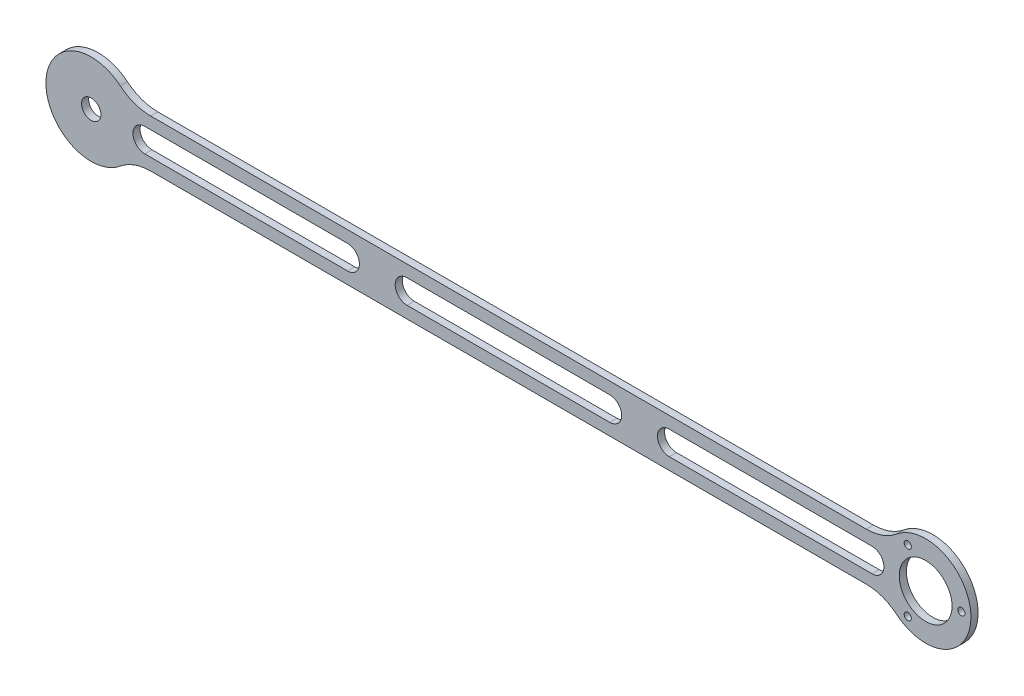
ISO-10303-21;
HEADER;
FILE_DESCRIPTION(('STEP AP214'),'2;1');
FILE_NAME('part.step','',(''),(''),'','','');
FILE_SCHEMA(('AUTOMOTIVE_DESIGN { 1 0 10303 214 1 1 1 1 }'));
ENDSEC;
DATA;
#1=APPLICATION_CONTEXT('core data for automotive mechanical design processes');
#2=APPLICATION_PROTOCOL_DEFINITION('international standard','automotive_design',2000,#1);
#3=PRODUCT_CONTEXT('',#1,'mechanical');
#4=PRODUCT('Part','Part','',(#3));
#5=PRODUCT_RELATED_PRODUCT_CATEGORY('part','',(#4));
#6=PRODUCT_DEFINITION_FORMATION('','',#4);
#7=PRODUCT_DEFINITION_CONTEXT('part definition',#1,'design');
#8=PRODUCT_DEFINITION('design','',#6,#7);
#9=PRODUCT_DEFINITION_SHAPE('','',#8);
#10=(LENGTH_UNIT() NAMED_UNIT(*) SI_UNIT(.MILLI.,.METRE.));
#11=(NAMED_UNIT(*) PLANE_ANGLE_UNIT() SI_UNIT($,.RADIAN.));
#12=(NAMED_UNIT(*) SI_UNIT($,.STERADIAN.) SOLID_ANGLE_UNIT());
#13=UNCERTAINTY_MEASURE_WITH_UNIT(LENGTH_MEASURE(1.E-05),#10,'distance_accuracy_value','');
#14=(GEOMETRIC_REPRESENTATION_CONTEXT(3) GLOBAL_UNCERTAINTY_ASSIGNED_CONTEXT((#13)) GLOBAL_UNIT_ASSIGNED_CONTEXT((#10,
#11,#12)) REPRESENTATION_CONTEXT('',''));
#15=CARTESIAN_POINT('',(0.,0.,0.));
#16=DIRECTION('',(0.,0.,1.));
#17=DIRECTION('',(1.,0.,0.));
#18=AXIS2_PLACEMENT_3D('',#15,#16,#17);
#19=CARTESIAN_POINT('',(350.,0.,1.5));
#20=DIRECTION('',(0.,0.,-1.));
#21=DIRECTION('',(-1.,0.,0.));
#22=AXIS2_PLACEMENT_3D('',#19,#20,#21);
#23=PLANE('',#22);
#24=DIRECTION('',(1.,0.,0.));
#25=VECTOR('',#24,1.);
#26=CARTESIAN_POINT('',(22.5,-5.,1.5));
#27=LINE('',#26,#25);
#28=CARTESIAN_POINT('',(22.5,-5.,1.5));
#29=VERTEX_POINT('',#28);
#30=CARTESIAN_POINT('',(107.5,-5.,1.5));
#31=VERTEX_POINT('',#30);
#32=EDGE_CURVE('E279',#29,#31,#27,.T.);
#33=ORIENTED_EDGE('',*,*,#32,.F.);
#34=CARTESIAN_POINT('',(22.5,0.,1.5));
#35=DIRECTION('',(0.,0.,1.));
#36=DIRECTION('',(1.,0.,0.));
#37=AXIS2_PLACEMENT_3D('',#34,#35,#36);
#38=CIRCLE('',#37,5.);
#39=CARTESIAN_POINT('',(22.5,5.,1.5));
#40=VERTEX_POINT('',#39);
#41=EDGE_CURVE('E141',#40,#29,#38,.T.);
#42=ORIENTED_EDGE('',*,*,#41,.F.);
#43=DIRECTION('',(-1.,0.,0.));
#44=VECTOR('',#43,1.);
#45=CARTESIAN_POINT('',(22.5,5.,1.5));
#46=LINE('',#45,#44);
#47=CARTESIAN_POINT('',(107.5,5.,1.5));
#48=VERTEX_POINT('',#47);
#49=EDGE_CURVE('E286',#48,#40,#46,.T.);
#50=ORIENTED_EDGE('',*,*,#49,.F.);
#51=CARTESIAN_POINT('',(107.5,0.,1.5));
#52=DIRECTION('',(0.,0.,1.));
#53=DIRECTION('',(1.,0.,0.));
#54=AXIS2_PLACEMENT_3D('',#51,#52,#53);
#55=CIRCLE('',#54,5.);
#56=EDGE_CURVE('E267',#31,#48,#55,.T.);
#57=ORIENTED_EDGE('',*,*,#56,.F.);
#58=EDGE_LOOP('',(#33,#42,#50,#57));
#59=FACE_BOUND('',#58,.T.);
#60=DIRECTION('',(1.,0.,0.));
#61=VECTOR('',#60,1.);
#62=CARTESIAN_POINT('',(132.5,-5.,1.5));
#63=LINE('',#62,#61);
#64=CARTESIAN_POINT('',(132.5,-5.,1.5));
#65=VERTEX_POINT('',#64);
#66=CARTESIAN_POINT('',(217.5,-5.,1.5));
#67=VERTEX_POINT('',#66);
#68=EDGE_CURVE('E351',#65,#67,#63,.T.);
#69=ORIENTED_EDGE('',*,*,#68,.F.);
#70=CARTESIAN_POINT('',(132.5,0.,1.5));
#71=DIRECTION('',(0.,0.,1.));
#72=DIRECTION('',(1.,0.,0.));
#73=AXIS2_PLACEMENT_3D('',#70,#71,#72);
#74=CIRCLE('',#73,5.);
#75=CARTESIAN_POINT('',(132.5,5.,1.5));
#76=VERTEX_POINT('',#75);
#77=EDGE_CURVE('E149',#76,#65,#74,.T.);
#78=ORIENTED_EDGE('',*,*,#77,.F.);
#79=DIRECTION('',(-1.,0.,0.));
#80=VECTOR('',#79,1.);
#81=CARTESIAN_POINT('',(132.5,5.,1.5));
#82=LINE('',#81,#80);
#83=CARTESIAN_POINT('',(217.5,5.00000000000002,1.5));
#84=VERTEX_POINT('',#83);
#85=EDGE_CURVE('E343',#84,#76,#82,.T.);
#86=ORIENTED_EDGE('',*,*,#85,.F.);
#87=CARTESIAN_POINT('',(217.5,0.,1.5));
#88=DIRECTION('',(0.,0.,1.));
#89=DIRECTION('',(1.,0.,0.));
#90=AXIS2_PLACEMENT_3D('',#87,#88,#89);
#91=CIRCLE('',#90,5.);
#92=EDGE_CURVE('E347',#67,#84,#91,.T.);
#93=ORIENTED_EDGE('',*,*,#92,.F.);
#94=EDGE_LOOP('',(#69,#78,#86,#93));
#95=FACE_BOUND('',#94,.T.);
#96=DIRECTION('',(1.,0.,0.));
#97=VECTOR('',#96,1.);
#98=CARTESIAN_POINT('',(242.5,-5.,1.5));
#99=LINE('',#98,#97);
#100=CARTESIAN_POINT('',(242.5,-5.,1.5));
#101=VERTEX_POINT('',#100);
#102=CARTESIAN_POINT('',(327.5,-5.,1.5));
#103=VERTEX_POINT('',#102);
#104=EDGE_CURVE('E394',#101,#103,#99,.T.);
#105=ORIENTED_EDGE('',*,*,#104,.F.);
#106=CARTESIAN_POINT('',(242.5,0.,1.5));
#107=DIRECTION('',(0.,0.,1.));
#108=DIRECTION('',(1.,0.,0.));
#109=AXIS2_PLACEMENT_3D('',#106,#107,#108);
#110=CIRCLE('',#109,5.);
#111=CARTESIAN_POINT('',(242.5,5.,1.5));
#112=VERTEX_POINT('',#111);
#113=EDGE_CURVE('E327',#112,#101,#110,.T.);
#114=ORIENTED_EDGE('',*,*,#113,.F.);
#115=DIRECTION('',(-1.,0.,0.));
#116=VECTOR('',#115,1.);
#117=CARTESIAN_POINT('',(242.5,5.,1.5));
#118=LINE('',#117,#116);
#119=CARTESIAN_POINT('',(327.5,5.,1.5));
#120=VERTEX_POINT('',#119);
#121=EDGE_CURVE('E386',#120,#112,#118,.T.);
#122=ORIENTED_EDGE('',*,*,#121,.F.);
#123=CARTESIAN_POINT('',(327.5,0.,1.5));
#124=DIRECTION('',(0.,0.,1.));
#125=DIRECTION('',(1.,0.,0.));
#126=AXIS2_PLACEMENT_3D('',#123,#124,#125);
#127=CIRCLE('',#126,5.);
#128=EDGE_CURVE('E390',#103,#120,#127,.T.);
#129=ORIENTED_EDGE('',*,*,#128,.F.);
#130=EDGE_LOOP('',(#105,#114,#122,#129));
#131=FACE_BOUND('',#130,.T.);
#132=CARTESIAN_POINT('',(365.,0.,1.5));
#133=DIRECTION('',(0.,0.,1.));
#134=DIRECTION('',(1.,0.,0.));
#135=AXIS2_PLACEMENT_3D('',#132,#133,#134);
#136=CIRCLE('',#135,1.50000000000002);
#137=CARTESIAN_POINT('',(366.5,0.,1.5));
#138=VERTEX_POINT('',#137);
#139=EDGE_CURVE('E400',#138,#138,#136,.T.);
#140=ORIENTED_EDGE('',*,*,#139,.F.);
#141=EDGE_LOOP('',(#140));
#142=FACE_BOUND('',#141,.T.);
#143=CARTESIAN_POINT('',(342.5,-12.9903810567666,1.5));
#144=DIRECTION('',(0.,0.,1.));
#145=DIRECTION('',(1.,0.,0.));
#146=AXIS2_PLACEMENT_3D('',#143,#144,#145);
#147=CIRCLE('',#146,1.50000000000008);
#148=CARTESIAN_POINT('',(344.,-12.9903810567666,1.5));
#149=VERTEX_POINT('',#148);
#150=EDGE_CURVE('E405',#149,#149,#147,.T.);
#151=ORIENTED_EDGE('',*,*,#150,.F.);
#152=EDGE_LOOP('',(#151));
#153=FACE_BOUND('',#152,.T.);
#154=CARTESIAN_POINT('',(342.5,12.9903810567665,1.5));
#155=DIRECTION('',(0.,0.,1.));
#156=DIRECTION('',(1.,0.,0.));
#157=AXIS2_PLACEMENT_3D('',#154,#155,#156);
#158=CIRCLE('',#157,1.50000000000002);
#159=CARTESIAN_POINT('',(344.,12.9903810567665,1.5));
#160=VERTEX_POINT('',#159);
#161=EDGE_CURVE('E414',#160,#160,#158,.T.);
#162=ORIENTED_EDGE('',*,*,#161,.F.);
#163=EDGE_LOOP('',(#162));
#164=FACE_BOUND('',#163,.T.);
#165=CARTESIAN_POINT('',(350.,0.,1.5));
#166=DIRECTION('',(0.,0.,-1.));
#167=DIRECTION('',(-1.,0.,0.));
#168=AXIS2_PLACEMENT_3D('',#165,#166,#167);
#169=CIRCLE('',#168,19.);
#170=CARTESIAN_POINT('',(337.859549738812,14.6153846153846,1.5));
#171=VERTEX_POINT('',#170);
#172=CARTESIAN_POINT('',(337.859549738812,-14.6153846153846,1.5));
#173=VERTEX_POINT('',#172);
#174=EDGE_CURVE('E440',#171,#173,#169,.T.);
#175=ORIENTED_EDGE('',*,*,#174,.F.);
#176=CARTESIAN_POINT('',(325.080128411246,30.,1.5));
#177=DIRECTION('',(0.,0.,-1.));
#178=DIRECTION('',(-1.,0.,0.));
#179=AXIS2_PLACEMENT_3D('',#176,#177,#178);
#180=CIRCLE('',#179,20.);
#181=CARTESIAN_POINT('',(325.080128411246,10.,1.5));
#182=VERTEX_POINT('',#181);
#183=EDGE_CURVE('E466',#171,#182,#180,.T.);
#184=ORIENTED_EDGE('',*,*,#183,.T.);
#185=DIRECTION('',(1.,0.,0.));
#186=VECTOR('',#185,1.);
#187=CARTESIAN_POINT('',(24.9198715887542,10.,1.5));
#188=LINE('',#187,#186);
#189=CARTESIAN_POINT('',(24.9198715887542,10.,1.5));
#190=VERTEX_POINT('',#189);
#191=EDGE_CURVE('E462',#190,#182,#188,.T.);
#192=ORIENTED_EDGE('',*,*,#191,.F.);
#193=CARTESIAN_POINT('',(24.9198715887542,30.,1.5));
#194=DIRECTION('',(0.,0.,1.));
#195=DIRECTION('',(1.,0.,0.));
#196=AXIS2_PLACEMENT_3D('',#193,#194,#195);
#197=CIRCLE('',#196,20.);
#198=CARTESIAN_POINT('',(12.140450261188,14.6153846153846,1.5));
#199=VERTEX_POINT('',#198);
#200=EDGE_CURVE('E458',#199,#190,#197,.T.);
#201=ORIENTED_EDGE('',*,*,#200,.F.);
#202=CARTESIAN_POINT('',(0.,0.,1.5));
#203=DIRECTION('',(0.,0.,-1.));
#204=DIRECTION('',(-1.,0.,0.));
#205=AXIS2_PLACEMENT_3D('',#202,#203,#204);
#206=CIRCLE('',#205,19.);
#207=CARTESIAN_POINT('',(12.140450261188,-14.6153846153846,1.5));
#208=VERTEX_POINT('',#207);
#209=EDGE_CURVE('E455',#208,#199,#206,.T.);
#210=ORIENTED_EDGE('',*,*,#209,.F.);
#211=CARTESIAN_POINT('',(24.9198715887542,-30.,1.5));
#212=DIRECTION('',(0.,0.,-1.));
#213=DIRECTION('',(-1.,0.,0.));
#214=AXIS2_PLACEMENT_3D('',#211,#212,#213);
#215=CIRCLE('',#214,20.);
#216=CARTESIAN_POINT('',(24.9198715887542,-10.,1.5));
#217=VERTEX_POINT('',#216);
#218=EDGE_CURVE('E452',#208,#217,#215,.T.);
#219=ORIENTED_EDGE('',*,*,#218,.T.);
#220=DIRECTION('',(1.,0.,0.));
#221=VECTOR('',#220,1.);
#222=CARTESIAN_POINT('',(24.9198715887542,-10.,1.5));
#223=LINE('',#222,#221);
#224=CARTESIAN_POINT('',(325.080128411246,-10.,1.5));
#225=VERTEX_POINT('',#224);
#226=EDGE_CURVE('E449',#217,#225,#223,.T.);
#227=ORIENTED_EDGE('',*,*,#226,.T.);
#228=CARTESIAN_POINT('',(325.080128411246,-30.,1.5));
#229=DIRECTION('',(0.,0.,1.));
#230=DIRECTION('',(1.,0.,0.));
#231=AXIS2_PLACEMENT_3D('',#228,#229,#230);
#232=CIRCLE('',#231,20.);
#233=EDGE_CURVE('E444',#173,#225,#232,.T.);
#234=ORIENTED_EDGE('',*,*,#233,.F.);
#235=EDGE_LOOP('',(#175,#184,#192,#201,#210,#219,#227,#234));
#236=FACE_BOUND('',#235,.T.);
#237=CARTESIAN_POINT('',(0.,0.,1.5));
#238=DIRECTION('',(0.,0.,1.));
#239=DIRECTION('',(1.,0.,0.));
#240=AXIS2_PLACEMENT_3D('',#237,#238,#239);
#241=CIRCLE('',#240,4.075);
#242=CARTESIAN_POINT('',(4.075,0.,1.5));
#243=VERTEX_POINT('',#242);
#244=EDGE_CURVE('E432',#243,#243,#241,.T.);
#245=ORIENTED_EDGE('',*,*,#244,.F.);
#246=EDGE_LOOP('',(#245));
#247=FACE_BOUND('',#246,.T.);
#248=CARTESIAN_POINT('',(350.,0.,1.5));
#249=DIRECTION('',(0.,0.,1.));
#250=DIRECTION('',(1.,0.,0.));
#251=AXIS2_PLACEMENT_3D('',#248,#249,#250);
#252=CIRCLE('',#251,11.075);
#253=CARTESIAN_POINT('',(361.075,0.,1.5));
#254=VERTEX_POINT('',#253);
#255=EDGE_CURVE('E424',#254,#254,#252,.T.);
#256=ORIENTED_EDGE('',*,*,#255,.F.);
#257=EDGE_LOOP('',(#256));
#258=FACE_BOUND('',#257,.T.);
#259=ADVANCED_FACE('F123',(#59,#95,#131,#142,#153,#164,#236,#247,#258),#23,.F.);
#260=CARTESIAN_POINT('',(350.,0.,-1.5));
#261=DIRECTION('',(0.,0.,-1.));
#262=DIRECTION('',(-1.,0.,0.));
#263=AXIS2_PLACEMENT_3D('',#260,#261,#262);
#264=PLANE('',#263);
#265=CARTESIAN_POINT('',(22.5,0.,-1.5));
#266=DIRECTION('',(0.,0.,1.));
#267=DIRECTION('',(1.,0.,0.));
#268=AXIS2_PLACEMENT_3D('',#265,#266,#267);
#269=CIRCLE('',#268,5.);
#270=CARTESIAN_POINT('',(22.5,5.,-1.5));
#271=VERTEX_POINT('',#270);
#272=CARTESIAN_POINT('',(22.5,-5.,-1.5));
#273=VERTEX_POINT('',#272);
#274=EDGE_CURVE('E290',#271,#273,#269,.T.);
#275=ORIENTED_EDGE('',*,*,#274,.T.);
#276=DIRECTION('',(1.,0.,0.));
#277=VECTOR('',#276,1.);
#278=CARTESIAN_POINT('',(22.5,-5.,-1.5));
#279=LINE('',#278,#277);
#280=CARTESIAN_POINT('',(107.5,-5.,-1.5));
#281=VERTEX_POINT('',#280);
#282=EDGE_CURVE('E297',#273,#281,#279,.T.);
#283=ORIENTED_EDGE('',*,*,#282,.T.);
#284=CARTESIAN_POINT('',(107.5,0.,-1.5));
#285=DIRECTION('',(0.,0.,1.));
#286=DIRECTION('',(1.,0.,0.));
#287=AXIS2_PLACEMENT_3D('',#284,#285,#286);
#288=CIRCLE('',#287,5.);
#289=CARTESIAN_POINT('',(107.5,5.,-1.5));
#290=VERTEX_POINT('',#289);
#291=EDGE_CURVE('E270',#281,#290,#288,.T.);
#292=ORIENTED_EDGE('',*,*,#291,.T.);
#293=DIRECTION('',(-1.,0.,0.));
#294=VECTOR('',#293,1.);
#295=CARTESIAN_POINT('',(22.5,5.,-1.5));
#296=LINE('',#295,#294);
#297=EDGE_CURVE('E302',#290,#271,#296,.T.);
#298=ORIENTED_EDGE('',*,*,#297,.T.);
#299=EDGE_LOOP('',(#275,#283,#292,#298));
#300=FACE_BOUND('',#299,.T.);
#301=CARTESIAN_POINT('',(132.5,0.,-1.5));
#302=DIRECTION('',(0.,0.,1.));
#303=DIRECTION('',(1.,0.,0.));
#304=AXIS2_PLACEMENT_3D('',#301,#302,#303);
#305=CIRCLE('',#304,5.);
#306=CARTESIAN_POINT('',(132.5,5.,-1.5));
#307=VERTEX_POINT('',#306);
#308=CARTESIAN_POINT('',(132.5,-5.,-1.5));
#309=VERTEX_POINT('',#308);
#310=EDGE_CURVE('E339',#307,#309,#305,.T.);
#311=ORIENTED_EDGE('',*,*,#310,.T.);
#312=DIRECTION('',(1.,0.,0.));
#313=VECTOR('',#312,1.);
#314=CARTESIAN_POINT('',(132.5,-5.,-1.5));
#315=LINE('',#314,#313);
#316=CARTESIAN_POINT('',(217.5,-4.99999999999998,-1.5));
#317=VERTEX_POINT('',#316);
#318=EDGE_CURVE('E335',#309,#317,#315,.T.);
#319=ORIENTED_EDGE('',*,*,#318,.T.);
#320=CARTESIAN_POINT('',(217.5,0.,-1.5));
#321=DIRECTION('',(0.,0.,1.));
#322=DIRECTION('',(1.,0.,0.));
#323=AXIS2_PLACEMENT_3D('',#320,#321,#322);
#324=CIRCLE('',#323,5.);
#325=CARTESIAN_POINT('',(217.5,5.00000000000002,-1.5));
#326=VERTEX_POINT('',#325);
#327=EDGE_CURVE('E331',#317,#326,#324,.T.);
#328=ORIENTED_EDGE('',*,*,#327,.T.);
#329=DIRECTION('',(-1.,0.,0.));
#330=VECTOR('',#329,1.);
#331=CARTESIAN_POINT('',(132.5,5.,-1.5));
#332=LINE('',#331,#330);
#333=EDGE_CURVE('E317',#326,#307,#332,.T.);
#334=ORIENTED_EDGE('',*,*,#333,.T.);
#335=EDGE_LOOP('',(#311,#319,#328,#334));
#336=FACE_BOUND('',#335,.T.);
#337=CARTESIAN_POINT('',(242.5,0.,-1.5));
#338=DIRECTION('',(0.,0.,1.));
#339=DIRECTION('',(1.,0.,0.));
#340=AXIS2_PLACEMENT_3D('',#337,#338,#339);
#341=CIRCLE('',#340,5.);
#342=CARTESIAN_POINT('',(242.5,5.,-1.5));
#343=VERTEX_POINT('',#342);
#344=CARTESIAN_POINT('',(242.5,-5.,-1.5));
#345=VERTEX_POINT('',#344);
#346=EDGE_CURVE('E382',#343,#345,#341,.T.);
#347=ORIENTED_EDGE('',*,*,#346,.T.);
#348=DIRECTION('',(1.,0.,0.));
#349=VECTOR('',#348,1.);
#350=CARTESIAN_POINT('',(242.5,-5.,-1.5));
#351=LINE('',#350,#349);
#352=CARTESIAN_POINT('',(327.5,-5.,-1.5));
#353=VERTEX_POINT('',#352);
#354=EDGE_CURVE('E378',#345,#353,#351,.T.);
#355=ORIENTED_EDGE('',*,*,#354,.T.);
#356=CARTESIAN_POINT('',(327.5,0.,-1.5));
#357=DIRECTION('',(0.,0.,1.));
#358=DIRECTION('',(1.,0.,0.));
#359=AXIS2_PLACEMENT_3D('',#356,#357,#358);
#360=CIRCLE('',#359,5.);
#361=CARTESIAN_POINT('',(327.5,5.,-1.5));
#362=VERTEX_POINT('',#361);
#363=EDGE_CURVE('E374',#353,#362,#360,.T.);
#364=ORIENTED_EDGE('',*,*,#363,.T.);
#365=DIRECTION('',(-1.,0.,0.));
#366=VECTOR('',#365,1.);
#367=CARTESIAN_POINT('',(242.5,5.,-1.5));
#368=LINE('',#367,#366);
#369=EDGE_CURVE('E361',#362,#343,#368,.T.);
#370=ORIENTED_EDGE('',*,*,#369,.T.);
#371=EDGE_LOOP('',(#347,#355,#364,#370));
#372=FACE_BOUND('',#371,.T.);
#373=CARTESIAN_POINT('',(365.,0.,-1.5));
#374=DIRECTION('',(0.,0.,1.));
#375=DIRECTION('',(1.,0.,0.));
#376=AXIS2_PLACEMENT_3D('',#373,#374,#375);
#377=CIRCLE('',#376,1.50000000000002);
#378=CARTESIAN_POINT('',(366.5,0.,-1.5));
#379=VERTEX_POINT('',#378);
#380=EDGE_CURVE('E404',#379,#379,#377,.T.);
#381=ORIENTED_EDGE('',*,*,#380,.T.);
#382=EDGE_LOOP('',(#381));
#383=FACE_BOUND('',#382,.T.);
#384=CARTESIAN_POINT('',(342.5,-12.9903810567666,-1.5));
#385=DIRECTION('',(0.,0.,1.));
#386=DIRECTION('',(1.,0.,0.));
#387=AXIS2_PLACEMENT_3D('',#384,#385,#386);
#388=CIRCLE('',#387,1.50000000000008);
#389=CARTESIAN_POINT('',(344.,-12.9903810567666,-1.5));
#390=VERTEX_POINT('',#389);
#391=EDGE_CURVE('E410',#390,#390,#388,.T.);
#392=ORIENTED_EDGE('',*,*,#391,.T.);
#393=EDGE_LOOP('',(#392));
#394=FACE_BOUND('',#393,.T.);
#395=CARTESIAN_POINT('',(342.5,12.9903810567665,-1.5));
#396=DIRECTION('',(0.,0.,1.));
#397=DIRECTION('',(1.,0.,0.));
#398=AXIS2_PLACEMENT_3D('',#395,#396,#397);
#399=CIRCLE('',#398,1.50000000000002);
#400=CARTESIAN_POINT('',(344.,12.9903810567665,-1.5));
#401=VERTEX_POINT('',#400);
#402=EDGE_CURVE('E309',#401,#401,#399,.T.);
#403=ORIENTED_EDGE('',*,*,#402,.T.);
#404=EDGE_LOOP('',(#403));
#405=FACE_BOUND('',#404,.T.);
#406=CARTESIAN_POINT('',(0.,0.,-1.5));
#407=DIRECTION('',(0.,0.,1.));
#408=DIRECTION('',(1.,0.,0.));
#409=AXIS2_PLACEMENT_3D('',#406,#407,#408);
#410=CIRCLE('',#409,4.075);
#411=CARTESIAN_POINT('',(4.075,0.,-1.5));
#412=VERTEX_POINT('',#411);
#413=EDGE_CURVE('E428',#412,#412,#410,.T.);
#414=ORIENTED_EDGE('',*,*,#413,.T.);
#415=EDGE_LOOP('',(#414));
#416=FACE_BOUND('',#415,.T.);
#417=CARTESIAN_POINT('',(350.,0.,-1.5));
#418=DIRECTION('',(0.,0.,1.));
#419=DIRECTION('',(1.,0.,0.));
#420=AXIS2_PLACEMENT_3D('',#417,#418,#419);
#421=CIRCLE('',#420,19.);
#422=CARTESIAN_POINT('',(337.859549738812,-14.6153846153846,-1.5));
#423=VERTEX_POINT('',#422);
#424=CARTESIAN_POINT('',(337.859549738812,14.6153846153846,-1.5));
#425=VERTEX_POINT('',#424);
#426=EDGE_CURVE('E445',#423,#425,#421,.T.);
#427=ORIENTED_EDGE('',*,*,#426,.F.);
#428=CARTESIAN_POINT('',(325.080128411246,-30.,-1.5));
#429=DIRECTION('',(0.,0.,1.));
#430=DIRECTION('',(1.,0.,0.));
#431=AXIS2_PLACEMENT_3D('',#428,#429,#430);
#432=CIRCLE('',#431,20.);
#433=CARTESIAN_POINT('',(325.080128411246,-10.,-1.5));
#434=VERTEX_POINT('',#433);
#435=EDGE_CURVE('E436',#423,#434,#432,.T.);
#436=ORIENTED_EDGE('',*,*,#435,.T.);
#437=DIRECTION('',(1.,0.,0.));
#438=VECTOR('',#437,1.);
#439=CARTESIAN_POINT('',(24.9198715887542,-10.,-1.5));
#440=LINE('',#439,#438);
#441=CARTESIAN_POINT('',(24.9198715887542,-10.,-1.5));
#442=VERTEX_POINT('',#441);
#443=EDGE_CURVE('E472',#442,#434,#440,.T.);
#444=ORIENTED_EDGE('',*,*,#443,.F.);
#445=CARTESIAN_POINT('',(24.9198715887542,-30.,-1.5));
#446=DIRECTION('',(0.,0.,-1.));
#447=DIRECTION('',(-1.,0.,0.));
#448=AXIS2_PLACEMENT_3D('',#445,#446,#447);
#449=CIRCLE('',#448,20.);
#450=CARTESIAN_POINT('',(12.140450261188,-14.6153846153846,-1.5));
#451=VERTEX_POINT('',#450);
#452=EDGE_CURVE('E476',#451,#442,#449,.T.);
#453=ORIENTED_EDGE('',*,*,#452,.F.);
#454=CARTESIAN_POINT('',(0.,0.,-1.5));
#455=DIRECTION('',(0.,0.,1.));
#456=DIRECTION('',(1.,0.,0.));
#457=AXIS2_PLACEMENT_3D('',#454,#455,#456);
#458=CIRCLE('',#457,19.);
#459=CARTESIAN_POINT('',(12.140450261188,14.6153846153846,-1.5));
#460=VERTEX_POINT('',#459);
#461=EDGE_CURVE('E479',#460,#451,#458,.T.);
#462=ORIENTED_EDGE('',*,*,#461,.F.);
#463=CARTESIAN_POINT('',(24.9198715887542,30.,-1.5));
#464=DIRECTION('',(0.,0.,1.));
#465=DIRECTION('',(1.,0.,0.));
#466=AXIS2_PLACEMENT_3D('',#463,#464,#465);
#467=CIRCLE('',#466,20.);
#468=CARTESIAN_POINT('',(24.9198715887542,10.,-1.5));
#469=VERTEX_POINT('',#468);
#470=EDGE_CURVE('E482',#460,#469,#467,.T.);
#471=ORIENTED_EDGE('',*,*,#470,.T.);
#472=DIRECTION('',(1.,0.,0.));
#473=VECTOR('',#472,1.);
#474=CARTESIAN_POINT('',(24.9198715887542,10.,-1.5));
#475=LINE('',#474,#473);
#476=CARTESIAN_POINT('',(325.080128411246,10.,-1.5));
#477=VERTEX_POINT('',#476);
#478=EDGE_CURVE('E486',#469,#477,#475,.T.);
#479=ORIENTED_EDGE('',*,*,#478,.T.);
#480=CARTESIAN_POINT('',(325.080128411246,30.,-1.5));
#481=DIRECTION('',(0.,0.,-1.));
#482=DIRECTION('',(-1.,0.,0.));
#483=AXIS2_PLACEMENT_3D('',#480,#481,#482);
#484=CIRCLE('',#483,20.);
#485=EDGE_CURVE('E490',#425,#477,#484,.T.);
#486=ORIENTED_EDGE('',*,*,#485,.F.);
#487=EDGE_LOOP('',(#427,#436,#444,#453,#462,#471,#479,#486));
#488=FACE_BOUND('',#487,.T.);
#489=CARTESIAN_POINT('',(350.,0.,-1.5));
#490=DIRECTION('',(0.,0.,1.));
#491=DIRECTION('',(1.,0.,0.));
#492=AXIS2_PLACEMENT_3D('',#489,#490,#491);
#493=CIRCLE('',#492,11.075);
#494=CARTESIAN_POINT('',(361.075,0.,-1.5));
#495=VERTEX_POINT('',#494);
#496=EDGE_CURVE('E409',#495,#495,#493,.T.);
#497=ORIENTED_EDGE('',*,*,#496,.T.);
#498=EDGE_LOOP('',(#497));
#499=FACE_BOUND('',#498,.T.);
#500=ADVANCED_FACE('F524',(#300,#336,#372,#383,#394,#405,#416,#488,#499),#264,.T.);
#501=CARTESIAN_POINT('',(350.,0.,1.5));
#502=DIRECTION('',(0.,0.,-1.));
#503=DIRECTION('',(-1.,0.,0.));
#504=AXIS2_PLACEMENT_3D('',#501,#502,#503);
#505=CYLINDRICAL_SURFACE('',#504,19.);
#506=ORIENTED_EDGE('',*,*,#426,.T.);
#507=DIRECTION('',(0.,0.,-1.));
#508=VECTOR('',#507,1.);
#509=CARTESIAN_POINT('',(337.859549738812,14.6153846153846,1.5));
#510=LINE('',#509,#508);
#511=EDGE_CURVE('E12',#171,#425,#510,.T.);
#512=ORIENTED_EDGE('',*,*,#511,.F.);
#513=ORIENTED_EDGE('',*,*,#174,.T.);
#514=DIRECTION('',(0.,0.,-1.));
#515=VECTOR('',#514,1.);
#516=CARTESIAN_POINT('',(337.859549738812,-14.6153846153846,1.5));
#517=LINE('',#516,#515);
#518=EDGE_CURVE('E127',#173,#423,#517,.T.);
#519=ORIENTED_EDGE('',*,*,#518,.T.);
#520=EDGE_LOOP('',(#506,#512,#513,#519));
#521=FACE_BOUND('',#520,.T.);
#522=ADVANCED_FACE('F519',(#521),#505,.T.);
#523=CARTESIAN_POINT('',(325.080128411246,30.,1.5));
#524=DIRECTION('',(0.,0.,-1.));
#525=DIRECTION('',(-1.,0.,0.));
#526=AXIS2_PLACEMENT_3D('',#523,#524,#525);
#527=CYLINDRICAL_SURFACE('',#526,20.);
#528=ORIENTED_EDGE('',*,*,#485,.T.);
#529=DIRECTION('',(0.,0.,-1.));
#530=VECTOR('',#529,1.);
#531=CARTESIAN_POINT('',(325.080128411246,10.,1.5));
#532=LINE('',#531,#530);
#533=EDGE_CURVE('E133',#182,#477,#532,.T.);
#534=ORIENTED_EDGE('',*,*,#533,.F.);
#535=ORIENTED_EDGE('',*,*,#183,.F.);
#536=ORIENTED_EDGE('',*,*,#511,.T.);
#537=EDGE_LOOP('',(#528,#534,#535,#536));
#538=FACE_BOUND('',#537,.T.);
#539=ADVANCED_FACE('F531',(#538),#527,.F.);
#540=CARTESIAN_POINT('',(24.9198715887542,10.,1.5));
#541=DIRECTION('',(0.,1.,0.));
#542=DIRECTION('',(0.,0.,1.));
#543=AXIS2_PLACEMENT_3D('',#540,#541,#542);
#544=PLANE('',#543);
#545=ORIENTED_EDGE('',*,*,#478,.F.);
#546=DIRECTION('',(0.,0.,-1.));
#547=VECTOR('',#546,1.);
#548=CARTESIAN_POINT('',(24.9198715887542,10.,1.5));
#549=LINE('',#548,#547);
#550=EDGE_CURVE('E498',#190,#469,#549,.T.);
#551=ORIENTED_EDGE('',*,*,#550,.F.);
#552=ORIENTED_EDGE('',*,*,#191,.T.);
#553=ORIENTED_EDGE('',*,*,#533,.T.);
#554=EDGE_LOOP('',(#545,#551,#552,#553));
#555=FACE_BOUND('',#554,.T.);
#556=ADVANCED_FACE('F552',(#555),#544,.T.);
#557=CARTESIAN_POINT('',(24.9198715887542,30.,1.5));
#558=DIRECTION('',(0.,0.,-1.));
#559=DIRECTION('',(-1.,0.,0.));
#560=AXIS2_PLACEMENT_3D('',#557,#558,#559);
#561=CYLINDRICAL_SURFACE('',#560,20.);
#562=ORIENTED_EDGE('',*,*,#470,.F.);
#563=DIRECTION('',(0.,0.,-1.));
#564=VECTOR('',#563,1.);
#565=CARTESIAN_POINT('',(12.140450261188,14.6153846153846,1.5));
#566=LINE('',#565,#564);
#567=EDGE_CURVE('E501',#199,#460,#566,.T.);
#568=ORIENTED_EDGE('',*,*,#567,.F.);
#569=ORIENTED_EDGE('',*,*,#200,.T.);
#570=ORIENTED_EDGE('',*,*,#550,.T.);
#571=EDGE_LOOP('',(#562,#568,#569,#570));
#572=FACE_BOUND('',#571,.T.);
#573=ADVANCED_FACE('F550',(#572),#561,.F.);
#574=CARTESIAN_POINT('',(0.,0.,1.5));
#575=DIRECTION('',(0.,0.,-1.));
#576=DIRECTION('',(-1.,0.,0.));
#577=AXIS2_PLACEMENT_3D('',#574,#575,#576);
#578=CYLINDRICAL_SURFACE('',#577,19.);
#579=ORIENTED_EDGE('',*,*,#461,.T.);
#580=DIRECTION('',(0.,0.,-1.));
#581=VECTOR('',#580,1.);
#582=CARTESIAN_POINT('',(12.140450261188,-14.6153846153846,1.5));
#583=LINE('',#582,#581);
#584=EDGE_CURVE('E504',#208,#451,#583,.T.);
#585=ORIENTED_EDGE('',*,*,#584,.F.);
#586=ORIENTED_EDGE('',*,*,#209,.T.);
#587=ORIENTED_EDGE('',*,*,#567,.T.);
#588=EDGE_LOOP('',(#579,#585,#586,#587));
#589=FACE_BOUND('',#588,.T.);
#590=ADVANCED_FACE('F559',(#589),#578,.T.);
#591=CARTESIAN_POINT('',(24.9198715887542,-30.,1.5));
#592=DIRECTION('',(0.,0.,-1.));
#593=DIRECTION('',(-1.,0.,0.));
#594=AXIS2_PLACEMENT_3D('',#591,#592,#593);
#595=CYLINDRICAL_SURFACE('',#594,20.);
#596=ORIENTED_EDGE('',*,*,#452,.T.);
#597=DIRECTION('',(0.,0.,-1.));
#598=VECTOR('',#597,1.);
#599=CARTESIAN_POINT('',(24.9198715887542,-10.,1.5));
#600=LINE('',#599,#598);
#601=EDGE_CURVE('E508',#217,#442,#600,.T.);
#602=ORIENTED_EDGE('',*,*,#601,.F.);
#603=ORIENTED_EDGE('',*,*,#218,.F.);
#604=ORIENTED_EDGE('',*,*,#584,.T.);
#605=EDGE_LOOP('',(#596,#602,#603,#604));
#606=FACE_BOUND('',#605,.T.);
#607=ADVANCED_FACE('F544',(#606),#595,.F.);
#608=CARTESIAN_POINT('',(24.9198715887542,-10.,1.5));
#609=DIRECTION('',(0.,1.,0.));
#610=DIRECTION('',(0.,0.,1.));
#611=AXIS2_PLACEMENT_3D('',#608,#609,#610);
#612=PLANE('',#611);
#613=ORIENTED_EDGE('',*,*,#443,.T.);
#614=DIRECTION('',(0.,0.,-1.));
#615=VECTOR('',#614,1.);
#616=CARTESIAN_POINT('',(325.080128411246,-10.,1.5));
#617=LINE('',#616,#615);
#618=EDGE_CURVE('E511',#225,#434,#617,.T.);
#619=ORIENTED_EDGE('',*,*,#618,.F.);
#620=ORIENTED_EDGE('',*,*,#226,.F.);
#621=ORIENTED_EDGE('',*,*,#601,.T.);
#622=EDGE_LOOP('',(#613,#619,#620,#621));
#623=FACE_BOUND('',#622,.T.);
#624=ADVANCED_FACE('F542',(#623),#612,.F.);
#625=CARTESIAN_POINT('',(325.080128411246,-30.,1.5));
#626=DIRECTION('',(0.,0.,-1.));
#627=DIRECTION('',(-1.,0.,0.));
#628=AXIS2_PLACEMENT_3D('',#625,#626,#627);
#629=CYLINDRICAL_SURFACE('',#628,20.);
#630=ORIENTED_EDGE('',*,*,#435,.F.);
#631=ORIENTED_EDGE('',*,*,#518,.F.);
#632=ORIENTED_EDGE('',*,*,#233,.T.);
#633=ORIENTED_EDGE('',*,*,#618,.T.);
#634=EDGE_LOOP('',(#630,#631,#632,#633));
#635=FACE_BOUND('',#634,.T.);
#636=ADVANCED_FACE('F125',(#635),#629,.F.);
#637=CARTESIAN_POINT('',(0.,0.,1.5));
#638=DIRECTION('',(0.,0.,-1.));
#639=DIRECTION('',(-1.,0.,0.));
#640=AXIS2_PLACEMENT_3D('',#637,#638,#639);
#641=CYLINDRICAL_SURFACE('',#640,4.075);
#642=ORIENTED_EDGE('',*,*,#244,.T.);
#643=EDGE_LOOP('',(#642));
#644=FACE_BOUND('',#643,.T.);
#645=ORIENTED_EDGE('',*,*,#413,.F.);
#646=EDGE_LOOP('',(#645));
#647=FACE_BOUND('',#646,.T.);
#648=ADVANCED_FACE('F571',(#644,#647),#641,.F.);
#649=CARTESIAN_POINT('',(350.,0.,1.5));
#650=DIRECTION('',(0.,0.,-1.));
#651=DIRECTION('',(-1.,0.,0.));
#652=AXIS2_PLACEMENT_3D('',#649,#650,#651);
#653=CYLINDRICAL_SURFACE('',#652,11.075);
#654=ORIENTED_EDGE('',*,*,#255,.T.);
#655=EDGE_LOOP('',(#654));
#656=FACE_BOUND('',#655,.T.);
#657=ORIENTED_EDGE('',*,*,#496,.F.);
#658=EDGE_LOOP('',(#657));
#659=FACE_BOUND('',#658,.T.);
#660=ADVANCED_FACE('F639',(#656,#659),#653,.F.);
#661=CARTESIAN_POINT('',(342.5,12.9903810567665,-1.5));
#662=DIRECTION('',(0.,0.,1.));
#663=DIRECTION('',(1.,0.,0.));
#664=AXIS2_PLACEMENT_3D('',#661,#662,#663);
#665=CYLINDRICAL_SURFACE('',#664,1.50000000000002);
#666=ORIENTED_EDGE('',*,*,#402,.F.);
#667=EDGE_LOOP('',(#666));
#668=FACE_BOUND('',#667,.T.);
#669=ORIENTED_EDGE('',*,*,#161,.T.);
#670=EDGE_LOOP('',(#669));
#671=FACE_BOUND('',#670,.T.);
#672=ADVANCED_FACE('F648',(#668,#671),#665,.F.);
#673=CARTESIAN_POINT('',(342.5,-12.9903810567666,-1.5));
#674=DIRECTION('',(0.,0.,1.));
#675=DIRECTION('',(1.,0.,0.));
#676=AXIS2_PLACEMENT_3D('',#673,#674,#675);
#677=CYLINDRICAL_SURFACE('',#676,1.50000000000008);
#678=ORIENTED_EDGE('',*,*,#391,.F.);
#679=EDGE_LOOP('',(#678));
#680=FACE_BOUND('',#679,.T.);
#681=ORIENTED_EDGE('',*,*,#150,.T.);
#682=EDGE_LOOP('',(#681));
#683=FACE_BOUND('',#682,.T.);
#684=ADVANCED_FACE('F657',(#680,#683),#677,.F.);
#685=CARTESIAN_POINT('',(365.,0.,-1.5));
#686=DIRECTION('',(0.,0.,1.));
#687=DIRECTION('',(1.,0.,0.));
#688=AXIS2_PLACEMENT_3D('',#685,#686,#687);
#689=CYLINDRICAL_SURFACE('',#688,1.50000000000002);
#690=ORIENTED_EDGE('',*,*,#380,.F.);
#691=EDGE_LOOP('',(#690));
#692=FACE_BOUND('',#691,.T.);
#693=ORIENTED_EDGE('',*,*,#139,.T.);
#694=EDGE_LOOP('',(#693));
#695=FACE_BOUND('',#694,.T.);
#696=ADVANCED_FACE('F667',(#692,#695),#689,.F.);
#697=CARTESIAN_POINT('',(242.5,0.,-1.5));
#698=DIRECTION('',(0.,0.,1.));
#699=DIRECTION('',(1.,0.,0.));
#700=AXIS2_PLACEMENT_3D('',#697,#698,#699);
#701=CYLINDRICAL_SURFACE('',#700,5.);
#702=DIRECTION('',(0.,0.,1.));
#703=VECTOR('',#702,1.);
#704=CARTESIAN_POINT('',(242.5,-5.,-1.5));
#705=LINE('',#704,#703);
#706=EDGE_CURVE('E357',#345,#101,#705,.T.);
#707=ORIENTED_EDGE('',*,*,#706,.F.);
#708=ORIENTED_EDGE('',*,*,#346,.F.);
#709=DIRECTION('',(0.,0.,1.));
#710=VECTOR('',#709,1.);
#711=CARTESIAN_POINT('',(242.5,5.,-1.5));
#712=LINE('',#711,#710);
#713=EDGE_CURVE('E368',#343,#112,#712,.T.);
#714=ORIENTED_EDGE('',*,*,#713,.T.);
#715=ORIENTED_EDGE('',*,*,#113,.T.);
#716=EDGE_LOOP('',(#707,#708,#714,#715));
#717=FACE_BOUND('',#716,.T.);
#718=ADVANCED_FACE('F676',(#717),#701,.F.);
#719=CARTESIAN_POINT('',(242.5,5.,-1.5));
#720=DIRECTION('',(0.,1.,0.));
#721=DIRECTION('',(0.,0.,1.));
#722=AXIS2_PLACEMENT_3D('',#719,#720,#721);
#723=PLANE('',#722);
#724=ORIENTED_EDGE('',*,*,#713,.F.);
#725=ORIENTED_EDGE('',*,*,#369,.F.);
#726=DIRECTION('',(0.,0.,1.));
#727=VECTOR('',#726,1.);
#728=CARTESIAN_POINT('',(327.5,5.,-1.5));
#729=LINE('',#728,#727);
#730=EDGE_CURVE('E365',#362,#120,#729,.T.);
#731=ORIENTED_EDGE('',*,*,#730,.T.);
#732=ORIENTED_EDGE('',*,*,#121,.T.);
#733=EDGE_LOOP('',(#724,#725,#731,#732));
#734=FACE_BOUND('',#733,.T.);
#735=ADVANCED_FACE('F686',(#734),#723,.F.);
#736=CARTESIAN_POINT('',(327.5,0.,-1.5));
#737=DIRECTION('',(0.,0.,1.));
#738=DIRECTION('',(1.,0.,0.));
#739=AXIS2_PLACEMENT_3D('',#736,#737,#738);
#740=CYLINDRICAL_SURFACE('',#739,5.);
#741=ORIENTED_EDGE('',*,*,#730,.F.);
#742=ORIENTED_EDGE('',*,*,#363,.F.);
#743=DIRECTION('',(0.,0.,1.));
#744=VECTOR('',#743,1.);
#745=CARTESIAN_POINT('',(327.5,-5.,-1.5));
#746=LINE('',#745,#744);
#747=EDGE_CURVE('E362',#353,#103,#746,.T.);
#748=ORIENTED_EDGE('',*,*,#747,.T.);
#749=ORIENTED_EDGE('',*,*,#128,.T.);
#750=EDGE_LOOP('',(#741,#742,#748,#749));
#751=FACE_BOUND('',#750,.T.);
#752=ADVANCED_FACE('F696',(#751),#740,.F.);
#753=CARTESIAN_POINT('',(242.5,-5.,-1.5));
#754=DIRECTION('',(0.,-1.,0.));
#755=DIRECTION('',(0.,0.,-1.));
#756=AXIS2_PLACEMENT_3D('',#753,#754,#755);
#757=PLANE('',#756);
#758=ORIENTED_EDGE('',*,*,#747,.F.);
#759=ORIENTED_EDGE('',*,*,#354,.F.);
#760=ORIENTED_EDGE('',*,*,#706,.T.);
#761=ORIENTED_EDGE('',*,*,#104,.T.);
#762=EDGE_LOOP('',(#758,#759,#760,#761));
#763=FACE_BOUND('',#762,.T.);
#764=ADVANCED_FACE('F706',(#763),#757,.F.);
#765=CARTESIAN_POINT('',(132.5,0.,-1.5));
#766=DIRECTION('',(0.,0.,1.));
#767=DIRECTION('',(1.,0.,0.));
#768=AXIS2_PLACEMENT_3D('',#765,#766,#767);
#769=CYLINDRICAL_SURFACE('',#768,5.);
#770=DIRECTION('',(0.,0.,1.));
#771=VECTOR('',#770,1.);
#772=CARTESIAN_POINT('',(132.5,-5.,-1.5));
#773=LINE('',#772,#771);
#774=EDGE_CURVE('E314',#309,#65,#773,.T.);
#775=ORIENTED_EDGE('',*,*,#774,.F.);
#776=ORIENTED_EDGE('',*,*,#310,.F.);
#777=DIRECTION('',(0.,0.,1.));
#778=VECTOR('',#777,1.);
#779=CARTESIAN_POINT('',(132.5,5.,-1.5));
#780=LINE('',#779,#778);
#781=EDGE_CURVE('E324',#307,#76,#780,.T.);
#782=ORIENTED_EDGE('',*,*,#781,.T.);
#783=ORIENTED_EDGE('',*,*,#77,.T.);
#784=EDGE_LOOP('',(#775,#776,#782,#783));
#785=FACE_BOUND('',#784,.T.);
#786=ADVANCED_FACE('F716',(#785),#769,.F.);
#787=CARTESIAN_POINT('',(132.5,5.,-1.5));
#788=DIRECTION('',(0.,1.,0.));
#789=DIRECTION('',(-1.,0.,0.));
#790=AXIS2_PLACEMENT_3D('',#787,#788,#789);
#791=PLANE('',#790);
#792=ORIENTED_EDGE('',*,*,#781,.F.);
#793=ORIENTED_EDGE('',*,*,#333,.F.);
#794=DIRECTION('',(0.,0.,1.));
#795=VECTOR('',#794,1.);
#796=CARTESIAN_POINT('',(217.5,5.00000000000002,-1.5));
#797=LINE('',#796,#795);
#798=EDGE_CURVE('E321',#326,#84,#797,.T.);
#799=ORIENTED_EDGE('',*,*,#798,.T.);
#800=ORIENTED_EDGE('',*,*,#85,.T.);
#801=EDGE_LOOP('',(#792,#793,#799,#800));
#802=FACE_BOUND('',#801,.T.);
#803=ADVANCED_FACE('F726',(#802),#791,.F.);
#804=CARTESIAN_POINT('',(217.5,0.,-1.5));
#805=DIRECTION('',(0.,0.,1.));
#806=DIRECTION('',(1.,0.,0.));
#807=AXIS2_PLACEMENT_3D('',#804,#805,#806);
#808=CYLINDRICAL_SURFACE('',#807,5.);
#809=ORIENTED_EDGE('',*,*,#798,.F.);
#810=ORIENTED_EDGE('',*,*,#327,.F.);
#811=DIRECTION('',(0.,0.,1.));
#812=VECTOR('',#811,1.);
#813=CARTESIAN_POINT('',(217.5,-5.,-1.5));
#814=LINE('',#813,#812);
#815=EDGE_CURVE('E318',#317,#67,#814,.T.);
#816=ORIENTED_EDGE('',*,*,#815,.T.);
#817=ORIENTED_EDGE('',*,*,#92,.T.);
#818=EDGE_LOOP('',(#809,#810,#816,#817));
#819=FACE_BOUND('',#818,.T.);
#820=ADVANCED_FACE('F735',(#819),#808,.F.);
#821=CARTESIAN_POINT('',(132.5,-5.,-1.5));
#822=DIRECTION('',(0.,-1.,0.));
#823=DIRECTION('',(1.,0.,0.));
#824=AXIS2_PLACEMENT_3D('',#821,#822,#823);
#825=PLANE('',#824);
#826=ORIENTED_EDGE('',*,*,#815,.F.);
#827=ORIENTED_EDGE('',*,*,#318,.F.);
#828=ORIENTED_EDGE('',*,*,#774,.T.);
#829=ORIENTED_EDGE('',*,*,#68,.T.);
#830=EDGE_LOOP('',(#826,#827,#828,#829));
#831=FACE_BOUND('',#830,.T.);
#832=ADVANCED_FACE('F745',(#831),#825,.F.);
#833=CARTESIAN_POINT('',(22.5,0.,-1.5));
#834=DIRECTION('',(0.,0.,1.));
#835=DIRECTION('',(1.,0.,0.));
#836=AXIS2_PLACEMENT_3D('',#833,#834,#835);
#837=CYLINDRICAL_SURFACE('',#836,5.);
#838=DIRECTION('',(0.,0.,1.));
#839=VECTOR('',#838,1.);
#840=CARTESIAN_POINT('',(22.5,-5.,-1.5));
#841=LINE('',#840,#839);
#842=EDGE_CURVE('E276',#273,#29,#841,.T.);
#843=ORIENTED_EDGE('',*,*,#842,.F.);
#844=ORIENTED_EDGE('',*,*,#274,.F.);
#845=DIRECTION('',(0.,0.,1.));
#846=VECTOR('',#845,1.);
#847=CARTESIAN_POINT('',(22.5,5.,-1.5));
#848=LINE('',#847,#846);
#849=EDGE_CURVE('E306',#271,#40,#848,.T.);
#850=ORIENTED_EDGE('',*,*,#849,.T.);
#851=ORIENTED_EDGE('',*,*,#41,.T.);
#852=EDGE_LOOP('',(#843,#844,#850,#851));
#853=FACE_BOUND('',#852,.T.);
#854=ADVANCED_FACE('F755',(#853),#837,.F.);
#855=CARTESIAN_POINT('',(22.5,5.,-1.5));
#856=DIRECTION('',(0.,1.,0.));
#857=DIRECTION('',(0.,0.,1.));
#858=AXIS2_PLACEMENT_3D('',#855,#856,#857);
#859=PLANE('',#858);
#860=ORIENTED_EDGE('',*,*,#849,.F.);
#861=ORIENTED_EDGE('',*,*,#297,.F.);
#862=DIRECTION('',(0.,0.,1.));
#863=VECTOR('',#862,1.);
#864=CARTESIAN_POINT('',(107.5,5.,-1.5));
#865=LINE('',#864,#863);
#866=EDGE_CURVE('E275',#290,#48,#865,.T.);
#867=ORIENTED_EDGE('',*,*,#866,.T.);
#868=ORIENTED_EDGE('',*,*,#49,.T.);
#869=EDGE_LOOP('',(#860,#861,#867,#868));
#870=FACE_BOUND('',#869,.T.);
#871=ADVANCED_FACE('F765',(#870),#859,.F.);
#872=CARTESIAN_POINT('',(107.5,0.,-1.5));
#873=DIRECTION('',(0.,0.,1.));
#874=DIRECTION('',(1.,0.,0.));
#875=AXIS2_PLACEMENT_3D('',#872,#873,#874);
#876=CYLINDRICAL_SURFACE('',#875,5.);
#877=ORIENTED_EDGE('',*,*,#866,.F.);
#878=ORIENTED_EDGE('',*,*,#291,.F.);
#879=DIRECTION('',(0.,0.,1.));
#880=VECTOR('',#879,1.);
#881=CARTESIAN_POINT('',(107.5,-5.,-1.5));
#882=LINE('',#881,#880);
#883=EDGE_CURVE('E263',#281,#31,#882,.T.);
#884=ORIENTED_EDGE('',*,*,#883,.T.);
#885=ORIENTED_EDGE('',*,*,#56,.T.);
#886=EDGE_LOOP('',(#877,#878,#884,#885));
#887=FACE_BOUND('',#886,.T.);
#888=ADVANCED_FACE('F265',(#887),#876,.F.);
#889=CARTESIAN_POINT('',(22.5,-5.,-1.5));
#890=DIRECTION('',(0.,-1.,0.));
#891=DIRECTION('',(0.,0.,-1.));
#892=AXIS2_PLACEMENT_3D('',#889,#890,#891);
#893=PLANE('',#892);
#894=ORIENTED_EDGE('',*,*,#883,.F.);
#895=ORIENTED_EDGE('',*,*,#282,.F.);
#896=ORIENTED_EDGE('',*,*,#842,.T.);
#897=ORIENTED_EDGE('',*,*,#32,.T.);
#898=EDGE_LOOP('',(#894,#895,#896,#897));
#899=FACE_BOUND('',#898,.T.);
#900=ADVANCED_FACE('F280',(#899),#893,.F.);
#901=CLOSED_SHELL('',(#259,#500,#522,#539,#556,#573,#590,#607,#624,#636,#648,#660,#672,#684,
#696,#718,#735,#752,#764,#786,#803,#820,#832,#854,#871,#888,#900));
#902=MANIFOLD_SOLID_BREP('B2',#901);
#903=ADVANCED_BREP_SHAPE_REPRESENTATION('',(#18,#902),#14);
#904=SHAPE_DEFINITION_REPRESENTATION(#9,#903);
ENDSEC;
END-ISO-10303-21;
